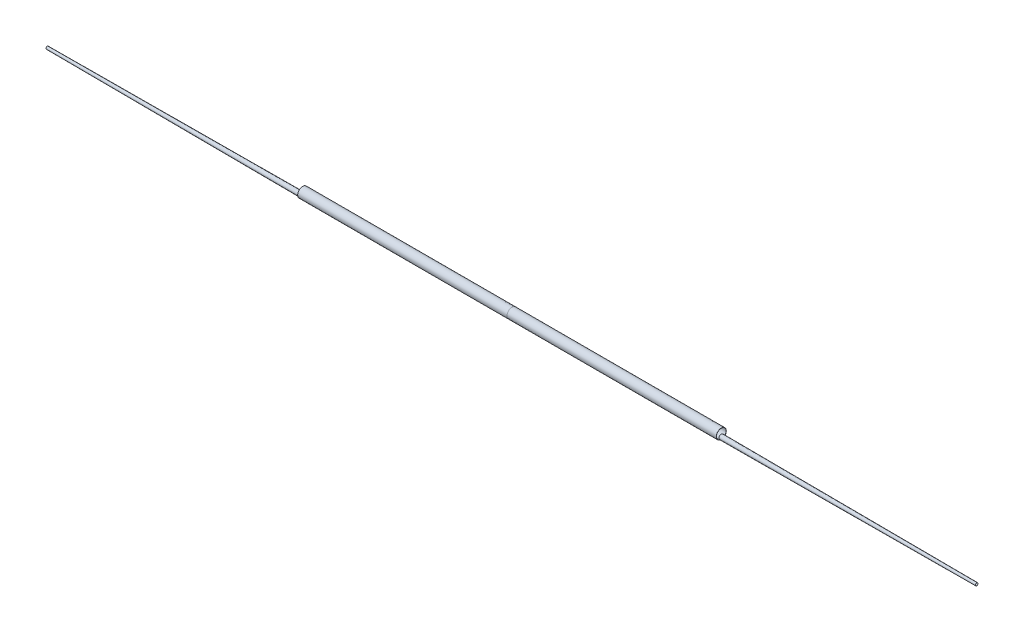
ISO-10303-21;
HEADER;
FILE_DESCRIPTION(('STEP AP214'),'2;1');
FILE_NAME('part.step','',(''),(''),'','','');
FILE_SCHEMA(('AUTOMOTIVE_DESIGN { 1 0 10303 214 1 1 1 1 }'));
ENDSEC;
DATA;
#1=APPLICATION_CONTEXT('core data for automotive mechanical design processes');
#2=APPLICATION_PROTOCOL_DEFINITION('international standard','automotive_design',2000,#1);
#3=PRODUCT_CONTEXT('',#1,'mechanical');
#4=PRODUCT('Part','Part','',(#3));
#5=PRODUCT_RELATED_PRODUCT_CATEGORY('part','',(#4));
#6=PRODUCT_DEFINITION_FORMATION('','',#4);
#7=PRODUCT_DEFINITION_CONTEXT('part definition',#1,'design');
#8=PRODUCT_DEFINITION('design','',#6,#7);
#9=PRODUCT_DEFINITION_SHAPE('','',#8);
#10=(LENGTH_UNIT() NAMED_UNIT(*) SI_UNIT(.MILLI.,.METRE.));
#11=(NAMED_UNIT(*) PLANE_ANGLE_UNIT() SI_UNIT($,.RADIAN.));
#12=(NAMED_UNIT(*) SI_UNIT($,.STERADIAN.) SOLID_ANGLE_UNIT());
#13=UNCERTAINTY_MEASURE_WITH_UNIT(LENGTH_MEASURE(1.E-05),#10,'distance_accuracy_value','');
#14=(GEOMETRIC_REPRESENTATION_CONTEXT(3) GLOBAL_UNCERTAINTY_ASSIGNED_CONTEXT((#13)) GLOBAL_UNIT_ASSIGNED_CONTEXT((#10,
#11,#12)) REPRESENTATION_CONTEXT('',''));
#15=CARTESIAN_POINT('',(0.,0.,0.));
#16=DIRECTION('',(0.,0.,1.));
#17=DIRECTION('',(1.,0.,0.));
#18=AXIS2_PLACEMENT_3D('',#15,#16,#17);
#19=CARTESIAN_POINT('',(-749.3,24.54402,-363.728));
#20=DIRECTION('',(1.,0.,0.));
#21=DIRECTION('',(0.,0.,1.));
#22=AXIS2_PLACEMENT_3D('',#19,#20,#21);
#23=CYLINDRICAL_SURFACE('',#22,17.907);
#24=CARTESIAN_POINT('',(-749.3,24.54402,-363.728));
#25=DIRECTION('',(1.,0.,0.));
#26=DIRECTION('',(0.,0.,-1.));
#27=AXIS2_PLACEMENT_3D('',#24,#25,#26);
#28=CIRCLE('',#27,17.907);
#29=CARTESIAN_POINT('',(-749.3,24.54402,-345.821));
#30=VERTEX_POINT('',#29);
#31=EDGE_CURVE('E12',#30,#30,#28,.T.);
#32=CARTESIAN_POINT('',(0.,24.54402,-363.728));
#33=DIRECTION('',(1.,0.,0.));
#34=DIRECTION('',(0.,0.,-1.));
#35=AXIS2_PLACEMENT_3D('',#32,#33,#34);
#36=CIRCLE('',#35,17.907);
#37=CARTESIAN_POINT('',(0.,24.54402,-345.821));
#38=VERTEX_POINT('',#37);
#39=EDGE_CURVE('E50',#38,#38,#36,.T.);
#40=CARTESIAN_POINT('',(-749.3,24.54402,-345.821));
#41=CARTESIAN_POINT('',(-741.494791666667,24.54402,-345.821));
#42=CARTESIAN_POINT('',(-733.689583333333,24.54402,-345.821));
#43=CARTESIAN_POINT('',(-718.079166666667,24.54402,-345.821));
#44=CARTESIAN_POINT('',(-710.273958333333,24.54402,-345.821));
#45=CARTESIAN_POINT('',(-694.663541666667,24.54402,-345.821));
#46=CARTESIAN_POINT('',(-686.858333333333,24.54402,-345.821));
#47=CARTESIAN_POINT('',(-671.247916666667,24.54402,-345.821));
#48=CARTESIAN_POINT('',(-663.442708333333,24.54402,-345.821));
#49=CARTESIAN_POINT('',(-647.832291666667,24.54402,-345.821));
#50=CARTESIAN_POINT('',(-640.027083333333,24.54402,-345.821));
#51=CARTESIAN_POINT('',(-624.416666666667,24.54402,-345.821));
#52=CARTESIAN_POINT('',(-616.611458333333,24.54402,-345.821));
#53=CARTESIAN_POINT('',(-601.001041666667,24.54402,-345.821));
#54=CARTESIAN_POINT('',(-593.195833333333,24.54402,-345.821));
#55=CARTESIAN_POINT('',(-577.585416666667,24.54402,-345.821));
#56=CARTESIAN_POINT('',(-569.780208333333,24.54402,-345.821));
#57=CARTESIAN_POINT('',(-554.169791666667,24.54402,-345.821));
#58=CARTESIAN_POINT('',(-546.364583333333,24.54402,-345.821));
#59=CARTESIAN_POINT('',(-530.754166666667,24.54402,-345.821));
#60=CARTESIAN_POINT('',(-522.948958333333,24.54402,-345.821));
#61=CARTESIAN_POINT('',(-507.338541666667,24.54402,-345.821));
#62=CARTESIAN_POINT('',(-499.533333333333,24.54402,-345.821));
#63=CARTESIAN_POINT('',(-483.922916666667,24.54402,-345.821));
#64=CARTESIAN_POINT('',(-476.117708333333,24.54402,-345.821));
#65=CARTESIAN_POINT('',(-460.507291666667,24.54402,-345.821));
#66=CARTESIAN_POINT('',(-452.702083333333,24.54402,-345.821));
#67=CARTESIAN_POINT('',(-437.091666666667,24.54402,-345.821));
#68=CARTESIAN_POINT('',(-429.286458333333,24.54402,-345.821));
#69=CARTESIAN_POINT('',(-413.676041666667,24.54402,-345.821));
#70=CARTESIAN_POINT('',(-405.870833333333,24.54402,-345.821));
#71=CARTESIAN_POINT('',(-390.260416666667,24.54402,-345.821));
#72=CARTESIAN_POINT('',(-382.455208333333,24.54402,-345.821));
#73=CARTESIAN_POINT('',(-366.844791666667,24.54402,-345.821));
#74=CARTESIAN_POINT('',(-359.039583333333,24.54402,-345.821));
#75=CARTESIAN_POINT('',(-343.429166666667,24.54402,-345.821));
#76=CARTESIAN_POINT('',(-335.623958333333,24.54402,-345.821));
#77=CARTESIAN_POINT('',(-320.013541666667,24.54402,-345.821));
#78=CARTESIAN_POINT('',(-312.208333333333,24.54402,-345.821));
#79=CARTESIAN_POINT('',(-296.597916666667,24.54402,-345.821));
#80=CARTESIAN_POINT('',(-288.792708333333,24.54402,-345.821));
#81=CARTESIAN_POINT('',(-273.182291666667,24.54402,-345.821));
#82=CARTESIAN_POINT('',(-265.377083333333,24.54402,-345.821));
#83=CARTESIAN_POINT('',(-249.766666666667,24.54402,-345.821));
#84=CARTESIAN_POINT('',(-241.961458333333,24.54402,-345.821));
#85=CARTESIAN_POINT('',(-226.351041666667,24.54402,-345.821));
#86=CARTESIAN_POINT('',(-218.545833333333,24.54402,-345.821));
#87=CARTESIAN_POINT('',(-202.935416666667,24.54402,-345.821));
#88=CARTESIAN_POINT('',(-195.130208333333,24.54402,-345.821));
#89=CARTESIAN_POINT('',(-179.519791666667,24.54402,-345.821));
#90=CARTESIAN_POINT('',(-171.714583333333,24.54402,-345.821));
#91=CARTESIAN_POINT('',(-156.104166666667,24.54402,-345.821));
#92=CARTESIAN_POINT('',(-148.298958333333,24.54402,-345.821));
#93=CARTESIAN_POINT('',(-132.688541666667,24.54402,-345.821));
#94=CARTESIAN_POINT('',(-124.883333333333,24.54402,-345.821));
#95=CARTESIAN_POINT('',(-109.272916666667,24.54402,-345.821));
#96=CARTESIAN_POINT('',(-101.467708333333,24.54402,-345.821));
#97=CARTESIAN_POINT('',(-85.8572916666667,24.54402,-345.821));
#98=CARTESIAN_POINT('',(-78.0520833333334,24.54402,-345.821));
#99=CARTESIAN_POINT('',(-62.4416666666667,24.54402,-345.821));
#100=CARTESIAN_POINT('',(-54.6364583333333,24.54402,-345.821));
#101=CARTESIAN_POINT('',(-39.0260416666667,24.54402,-345.821));
#102=CARTESIAN_POINT('',(-31.2208333333334,24.54402,-345.821));
#103=CARTESIAN_POINT('',(-15.6104166666667,24.54402,-345.821));
#104=CARTESIAN_POINT('',(-7.80520833333335,24.54402,-345.821));
#105=CARTESIAN_POINT('',(0.,24.54402,-345.821));
#106=B_SPLINE_CURVE_WITH_KNOTS('',3,(#40,#41,#42,#43,#44,#45,#46,#47,#48,#49,#50,#51,#52,#53,
#54,#55,#56,#57,#58,#59,#60,#61,#62,#63,#64,#65,#66,#67,#68,#69,#70,#71,#72,#73,#74,#75,#76,#77,
#78,#79,#80,#81,#82,#83,#84,#85,#86,#87,#88,#89,#90,#91,#92,#93,#94,#95,#96,#97,#98,#99,#100,
#101,#102,#103,#104,#105),.UNSPECIFIED.,.F.,.F.,(4,2,2,2,2,2,2,2,2,2,2,2,2,2,2,2,2,2,2,2,2,2,2,
2,2,2,2,2,2,2,2,2,4),(0.,23.4156250000001,46.8312500000001,70.246875,93.6625000000001,
117.078125,140.49375,163.909375,187.325,210.740625,234.15625,257.571875,280.9875,304.403125,
327.81875,351.234375,374.65,398.065625,421.48125,444.896875,468.3125,491.728125,515.14375,
538.559375,561.975,585.390625,608.80625,632.221875,655.6375,679.053125,702.46875,725.884375,
749.3),.UNSPECIFIED.);
#107=EDGE_CURVE('BSEAM47',#30,#38,#106,.T.);
#108=ORIENTED_EDGE('',*,*,#31,.T.);
#109=ORIENTED_EDGE('',*,*,#39,.F.);
#110=ORIENTED_EDGE('',*,*,#107,.T.);
#111=ORIENTED_EDGE('',*,*,#107,.F.);
#112=EDGE_LOOP('',(#108,#110,#109,#111));
#113=FACE_BOUND('',#112,.T.);
#114=ADVANCED_FACE('F47',(#113),#23,.T.);
#115=CARTESIAN_POINT('',(-749.3,24.54402,-363.728));
#116=DIRECTION('',(-1.,0.,0.));
#117=DIRECTION('',(0.,0.,-1.));
#118=AXIS2_PLACEMENT_3D('',#115,#116,#117);
#119=PLANE('',#118);
#120=CARTESIAN_POINT('',(-749.3,24.54402,-363.728));
#121=DIRECTION('',(1.,0.,0.));
#122=DIRECTION('',(0.,0.,-1.));
#123=AXIS2_PLACEMENT_3D('',#120,#121,#122);
#124=CIRCLE('',#123,17.145);
#125=CARTESIAN_POINT('',(-749.3,24.54402,-346.583));
#126=VERTEX_POINT('',#125);
#127=EDGE_CURVE('E57',#126,#126,#124,.T.);
#128=ORIENTED_EDGE('',*,*,#127,.T.);
#129=EDGE_LOOP('',(#128));
#130=FACE_BOUND('',#129,.T.);
#131=ORIENTED_EDGE('',*,*,#31,.F.);
#132=EDGE_LOOP('',(#131));
#133=FACE_BOUND('',#132,.T.);
#134=ADVANCED_FACE('F65',(#130,#133),#119,.T.);
#135=CARTESIAN_POINT('',(0.,24.54402,-363.728));
#136=DIRECTION('',(-1.,0.,0.));
#137=DIRECTION('',(0.,0.,-1.));
#138=AXIS2_PLACEMENT_3D('',#135,#136,#137);
#139=PLANE('',#138);
#140=CARTESIAN_POINT('',(0.,24.54402,-363.728));
#141=DIRECTION('',(1.,0.,0.));
#142=DIRECTION('',(0.,0.,-1.));
#143=AXIS2_PLACEMENT_3D('',#140,#141,#142);
#144=CIRCLE('',#143,17.145);
#145=CARTESIAN_POINT('',(0.,24.54402,-346.583));
#146=VERTEX_POINT('',#145);
#147=EDGE_CURVE('E59',#146,#146,#144,.T.);
#148=ORIENTED_EDGE('',*,*,#147,.F.);
#149=EDGE_LOOP('',(#148));
#150=FACE_BOUND('',#149,.T.);
#151=ORIENTED_EDGE('',*,*,#39,.T.);
#152=EDGE_LOOP('',(#151));
#153=FACE_BOUND('',#152,.T.);
#154=ADVANCED_FACE('F71',(#150,#153),#139,.F.);
#155=CARTESIAN_POINT('',(-749.3,24.54402,-363.728));
#156=DIRECTION('',(1.,0.,0.));
#157=DIRECTION('',(0.,0.,1.));
#158=AXIS2_PLACEMENT_3D('',#155,#156,#157);
#159=CYLINDRICAL_SURFACE('',#158,17.145);
#160=CARTESIAN_POINT('',(-749.3,24.54402,-346.583));
#161=CARTESIAN_POINT('',(-741.494791666667,24.54402,-346.583));
#162=CARTESIAN_POINT('',(-733.689583333333,24.54402,-346.583));
#163=CARTESIAN_POINT('',(-718.079166666667,24.54402,-346.583));
#164=CARTESIAN_POINT('',(-710.273958333333,24.54402,-346.583));
#165=CARTESIAN_POINT('',(-694.663541666667,24.54402,-346.583));
#166=CARTESIAN_POINT('',(-686.858333333333,24.54402,-346.583));
#167=CARTESIAN_POINT('',(-671.247916666667,24.54402,-346.583));
#168=CARTESIAN_POINT('',(-663.442708333333,24.54402,-346.583));
#169=CARTESIAN_POINT('',(-647.832291666667,24.54402,-346.583));
#170=CARTESIAN_POINT('',(-640.027083333333,24.54402,-346.583));
#171=CARTESIAN_POINT('',(-624.416666666667,24.54402,-346.583));
#172=CARTESIAN_POINT('',(-616.611458333333,24.54402,-346.583));
#173=CARTESIAN_POINT('',(-601.001041666667,24.54402,-346.583));
#174=CARTESIAN_POINT('',(-593.195833333333,24.54402,-346.583));
#175=CARTESIAN_POINT('',(-577.585416666667,24.54402,-346.583));
#176=CARTESIAN_POINT('',(-569.780208333333,24.54402,-346.583));
#177=CARTESIAN_POINT('',(-554.169791666667,24.54402,-346.583));
#178=CARTESIAN_POINT('',(-546.364583333333,24.54402,-346.583));
#179=CARTESIAN_POINT('',(-530.754166666667,24.54402,-346.583));
#180=CARTESIAN_POINT('',(-522.948958333333,24.54402,-346.583));
#181=CARTESIAN_POINT('',(-507.338541666667,24.54402,-346.583));
#182=CARTESIAN_POINT('',(-499.533333333333,24.54402,-346.583));
#183=CARTESIAN_POINT('',(-483.922916666667,24.54402,-346.583));
#184=CARTESIAN_POINT('',(-476.117708333333,24.54402,-346.583));
#185=CARTESIAN_POINT('',(-460.507291666667,24.54402,-346.583));
#186=CARTESIAN_POINT('',(-452.702083333333,24.54402,-346.583));
#187=CARTESIAN_POINT('',(-437.091666666667,24.54402,-346.583));
#188=CARTESIAN_POINT('',(-429.286458333333,24.54402,-346.583));
#189=CARTESIAN_POINT('',(-413.676041666667,24.54402,-346.583));
#190=CARTESIAN_POINT('',(-405.870833333333,24.54402,-346.583));
#191=CARTESIAN_POINT('',(-390.260416666667,24.54402,-346.583));
#192=CARTESIAN_POINT('',(-382.455208333333,24.54402,-346.583));
#193=CARTESIAN_POINT('',(-366.844791666667,24.54402,-346.583));
#194=CARTESIAN_POINT('',(-359.039583333333,24.54402,-346.583));
#195=CARTESIAN_POINT('',(-343.429166666667,24.54402,-346.583));
#196=CARTESIAN_POINT('',(-335.623958333333,24.54402,-346.583));
#197=CARTESIAN_POINT('',(-320.013541666667,24.54402,-346.583));
#198=CARTESIAN_POINT('',(-312.208333333333,24.54402,-346.583));
#199=CARTESIAN_POINT('',(-296.597916666667,24.54402,-346.583));
#200=CARTESIAN_POINT('',(-288.792708333333,24.54402,-346.583));
#201=CARTESIAN_POINT('',(-273.182291666667,24.54402,-346.583));
#202=CARTESIAN_POINT('',(-265.377083333333,24.54402,-346.583));
#203=CARTESIAN_POINT('',(-249.766666666667,24.54402,-346.583));
#204=CARTESIAN_POINT('',(-241.961458333333,24.54402,-346.583));
#205=CARTESIAN_POINT('',(-226.351041666667,24.54402,-346.583));
#206=CARTESIAN_POINT('',(-218.545833333333,24.54402,-346.583));
#207=CARTESIAN_POINT('',(-202.935416666667,24.54402,-346.583));
#208=CARTESIAN_POINT('',(-195.130208333333,24.54402,-346.583));
#209=CARTESIAN_POINT('',(-179.519791666667,24.54402,-346.583));
#210=CARTESIAN_POINT('',(-171.714583333333,24.54402,-346.583));
#211=CARTESIAN_POINT('',(-156.104166666667,24.54402,-346.583));
#212=CARTESIAN_POINT('',(-148.298958333333,24.54402,-346.583));
#213=CARTESIAN_POINT('',(-132.688541666667,24.54402,-346.583));
#214=CARTESIAN_POINT('',(-124.883333333333,24.54402,-346.583));
#215=CARTESIAN_POINT('',(-109.272916666667,24.54402,-346.583));
#216=CARTESIAN_POINT('',(-101.467708333333,24.54402,-346.583));
#217=CARTESIAN_POINT('',(-85.8572916666667,24.54402,-346.583));
#218=CARTESIAN_POINT('',(-78.0520833333334,24.54402,-346.583));
#219=CARTESIAN_POINT('',(-62.4416666666667,24.54402,-346.583));
#220=CARTESIAN_POINT('',(-54.6364583333333,24.54402,-346.583));
#221=CARTESIAN_POINT('',(-39.0260416666667,24.54402,-346.583));
#222=CARTESIAN_POINT('',(-31.2208333333334,24.54402,-346.583));
#223=CARTESIAN_POINT('',(-15.6104166666667,24.54402,-346.583));
#224=CARTESIAN_POINT('',(-7.80520833333335,24.54402,-346.583));
#225=CARTESIAN_POINT('',(0.,24.54402,-346.583));
#226=B_SPLINE_CURVE_WITH_KNOTS('',3,(#160,#161,#162,#163,#164,#165,#166,#167,#168,#169,#170,
#171,#172,#173,#174,#175,#176,#177,#178,#179,#180,#181,#182,#183,#184,#185,#186,#187,#188,#189,
#190,#191,#192,#193,#194,#195,#196,#197,#198,#199,#200,#201,#202,#203,#204,#205,#206,#207,#208,
#209,#210,#211,#212,#213,#214,#215,#216,#217,#218,#219,#220,#221,#222,#223,#224,#225),
.UNSPECIFIED.,.F.,.F.,(4,2,2,2,2,2,2,2,2,2,2,2,2,2,2,2,2,2,2,2,2,2,2,2,2,2,2,2,2,2,2,2,4),(0.,
23.4156250000001,46.8312500000001,70.246875,93.6625000000001,117.078125,140.49375,163.909375,
187.325,210.740625,234.15625,257.571875,280.9875,304.403125,327.81875,351.234375,374.65,
398.065625,421.48125,444.896875,468.3125,491.728125,515.14375,538.559375,561.975,585.390625,
608.80625,632.221875,655.6375,679.053125,702.46875,725.884375,749.3),.UNSPECIFIED.);
#227=EDGE_CURVE('BSEAM68',#126,#146,#226,.T.);
#228=ORIENTED_EDGE('',*,*,#127,.F.);
#229=ORIENTED_EDGE('',*,*,#147,.T.);
#230=ORIENTED_EDGE('',*,*,#227,.T.);
#231=ORIENTED_EDGE('',*,*,#227,.F.);
#232=EDGE_LOOP('',(#228,#230,#229,#231));
#233=FACE_BOUND('',#232,.T.);
#234=ADVANCED_FACE('F68',(#233),#159,.F.);
#235=CLOSED_SHELL('',(#114,#134,#154,#234));
#236=MANIFOLD_SOLID_BREP('B2',#235);
#237=CARTESIAN_POINT('',(-749.3,15.08252,-363.728));
#238=DIRECTION('',(-1.,0.,0.));
#239=DIRECTION('',(0.,0.,-1.));
#240=AXIS2_PLACEMENT_3D('',#237,#238,#239);
#241=PLANE('',#240);
#242=CARTESIAN_POINT('',(-749.3,15.08252,-363.728));
#243=DIRECTION('',(1.,0.,0.));
#244=DIRECTION('',(0.,0.,-1.));
#245=AXIS2_PLACEMENT_3D('',#242,#243,#244);
#246=CIRCLE('',#245,8.19149782444834);
#247=CARTESIAN_POINT('',(-749.3,15.08252,-371.919497824448));
#248=VERTEX_POINT('',#247);
#249=EDGE_CURVE('E129',#248,#248,#246,.T.);
#250=ORIENTED_EDGE('',*,*,#249,.F.);
#251=EDGE_LOOP('',(#250));
#252=FACE_BOUND('',#251,.T.);
#253=CARTESIAN_POINT('',(-749.3,15.08252,-363.728));
#254=DIRECTION('',(1.,0.,0.));
#255=DIRECTION('',(0.,0.,-1.));
#256=AXIS2_PLACEMENT_3D('',#253,#254,#255);
#257=CIRCLE('',#256,8.44549999999998);
#258=CARTESIAN_POINT('',(-749.3,15.08252,-372.1735));
#259=VERTEX_POINT('',#258);
#260=EDGE_CURVE('E46',#259,#259,#257,.T.);
#261=ORIENTED_EDGE('',*,*,#260,.T.);
#262=EDGE_LOOP('',(#261));
#263=FACE_BOUND('',#262,.T.);
#264=ADVANCED_FACE('F116',(#252,#263),#241,.F.);
#265=CARTESIAN_POINT('',(-1663.7,15.08252,-363.728));
#266=DIRECTION('',(-1.,0.,0.));
#267=DIRECTION('',(0.,0.,-1.));
#268=AXIS2_PLACEMENT_3D('',#265,#266,#267);
#269=PLANE('',#268);
#270=CARTESIAN_POINT('',(-1663.7,15.08252,-363.728));
#271=DIRECTION('',(1.,0.,0.));
#272=DIRECTION('',(0.,0.,-1.));
#273=AXIS2_PLACEMENT_3D('',#270,#271,#272);
#274=CIRCLE('',#273,4.40689782444836);
#275=CARTESIAN_POINT('',(-1663.7,15.08252,-368.134897824448));
#276=VERTEX_POINT('',#275);
#277=EDGE_CURVE('E185',#276,#276,#274,.T.);
#278=ORIENTED_EDGE('',*,*,#277,.T.);
#279=EDGE_LOOP('',(#278));
#280=FACE_BOUND('',#279,.T.);
#281=CARTESIAN_POINT('',(-1663.7,15.08252,-363.728));
#282=DIRECTION('',(1.,0.,0.));
#283=DIRECTION('',(0.,0.,-1.));
#284=AXIS2_PLACEMENT_3D('',#281,#282,#283);
#285=CIRCLE('',#284,4.6609);
#286=CARTESIAN_POINT('',(-1663.7,15.08252,-368.3889));
#287=VERTEX_POINT('',#286);
#288=EDGE_CURVE('E124',#287,#287,#285,.T.);
#289=ORIENTED_EDGE('',*,*,#288,.F.);
#290=EDGE_LOOP('',(#289));
#291=FACE_BOUND('',#290,.T.);
#292=ADVANCED_FACE('F148',(#280,#291),#269,.T.);
#293=CARTESIAN_POINT('',(-1663.7,15.08252,-363.728));
#294=DIRECTION('',(1.,0.,0.));
#295=DIRECTION('',(0.,0.,1.));
#296=AXIS2_PLACEMENT_3D('',#293,#294,#295);
#297=CONICAL_SURFACE('',#296,4.6609,0.00413886525552267);
#298=ORIENTED_EDGE('',*,*,#288,.T.);
#299=EDGE_LOOP('',(#298));
#300=FACE_BOUND('',#299,.T.);
#301=ORIENTED_EDGE('',*,*,#260,.F.);
#302=EDGE_LOOP('',(#301));
#303=FACE_BOUND('',#302,.T.);
#304=ADVANCED_FACE('F157',(#300,#303),#297,.T.);
#305=CARTESIAN_POINT('',(-1663.69894873123,15.08252,-363.728));
#306=DIRECTION('',(1.,0.,0.));
#307=DIRECTION('',(0.,0.,1.));
#308=AXIS2_PLACEMENT_3D('',#305,#306,#307);
#309=CONICAL_SURFACE('',#308,4.40690217553301,0.00413886525552267);
#310=ORIENTED_EDGE('',*,*,#277,.F.);
#311=EDGE_LOOP('',(#310));
#312=FACE_BOUND('',#311,.T.);
#313=ORIENTED_EDGE('',*,*,#249,.T.);
#314=EDGE_LOOP('',(#313));
#315=FACE_BOUND('',#314,.T.);
#316=ADVANCED_FACE('F159',(#312,#315),#309,.F.);
#317=CLOSED_SHELL('',(#264,#292,#304,#316));
#318=MANIFOLD_SOLID_BREP('B7',#317);
#319=CARTESIAN_POINT('',(749.3,15.08252,-363.728));
#320=DIRECTION('',(1.,0.,0.));
#321=DIRECTION('',(0.,0.,-1.));
#322=AXIS2_PLACEMENT_3D('',#319,#320,#321);
#323=PLANE('',#322);
#324=CARTESIAN_POINT('',(749.3,15.08252,-363.728));
#325=DIRECTION('',(1.,0.,0.));
#326=DIRECTION('',(0.,0.,-1.));
#327=AXIS2_PLACEMENT_3D('',#324,#325,#326);
#328=CIRCLE('',#327,8.19149782444834);
#329=CARTESIAN_POINT('',(749.3,15.08252,-371.919497824448));
#330=VERTEX_POINT('',#329);
#331=EDGE_CURVE('E241',#330,#330,#328,.T.);
#332=ORIENTED_EDGE('',*,*,#331,.T.);
#333=EDGE_LOOP('',(#332));
#334=FACE_BOUND('',#333,.T.);
#335=CARTESIAN_POINT('',(749.3,15.08252,-363.728));
#336=DIRECTION('',(1.,0.,0.));
#337=DIRECTION('',(0.,0.,-1.));
#338=AXIS2_PLACEMENT_3D('',#335,#336,#337);
#339=CIRCLE('',#338,8.44549999999998);
#340=CARTESIAN_POINT('',(749.3,15.08252,-372.1735));
#341=VERTEX_POINT('',#340);
#342=EDGE_CURVE('E115',#341,#341,#339,.T.);
#343=ORIENTED_EDGE('',*,*,#342,.F.);
#344=EDGE_LOOP('',(#343));
#345=FACE_BOUND('',#344,.T.);
#346=ADVANCED_FACE('F228',(#334,#345),#323,.F.);
#347=CARTESIAN_POINT('',(1663.7,15.08252,-363.728));
#348=DIRECTION('',(1.,0.,0.));
#349=DIRECTION('',(0.,0.,-1.));
#350=AXIS2_PLACEMENT_3D('',#347,#348,#349);
#351=PLANE('',#350);
#352=CARTESIAN_POINT('',(1663.7,15.08252,-363.728));
#353=DIRECTION('',(1.,0.,0.));
#354=DIRECTION('',(0.,0.,-1.));
#355=AXIS2_PLACEMENT_3D('',#352,#353,#354);
#356=CIRCLE('',#355,4.40689782444836);
#357=CARTESIAN_POINT('',(1663.7,15.08252,-368.134897824448));
#358=VERTEX_POINT('',#357);
#359=EDGE_CURVE('E297',#358,#358,#356,.T.);
#360=ORIENTED_EDGE('',*,*,#359,.F.);
#361=EDGE_LOOP('',(#360));
#362=FACE_BOUND('',#361,.T.);
#363=CARTESIAN_POINT('',(1663.7,15.08252,-363.728));
#364=DIRECTION('',(1.,0.,0.));
#365=DIRECTION('',(0.,0.,-1.));
#366=AXIS2_PLACEMENT_3D('',#363,#364,#365);
#367=CIRCLE('',#366,4.6609);
#368=CARTESIAN_POINT('',(1663.7,15.08252,-368.3889));
#369=VERTEX_POINT('',#368);
#370=EDGE_CURVE('E236',#369,#369,#367,.T.);
#371=ORIENTED_EDGE('',*,*,#370,.T.);
#372=EDGE_LOOP('',(#371));
#373=FACE_BOUND('',#372,.T.);
#374=ADVANCED_FACE('F261',(#362,#373),#351,.T.);
#375=CARTESIAN_POINT('',(1663.7,15.08252,-363.728));
#376=DIRECTION('',(-1.,0.,0.));
#377=DIRECTION('',(0.,0.,1.));
#378=AXIS2_PLACEMENT_3D('',#375,#376,#377);
#379=CONICAL_SURFACE('',#378,4.6609,0.00413886525552267);
#380=ORIENTED_EDGE('',*,*,#370,.F.);
#381=EDGE_LOOP('',(#380));
#382=FACE_BOUND('',#381,.T.);
#383=ORIENTED_EDGE('',*,*,#342,.T.);
#384=EDGE_LOOP('',(#383));
#385=FACE_BOUND('',#384,.T.);
#386=ADVANCED_FACE('F270',(#382,#385),#379,.T.);
#387=CARTESIAN_POINT('',(1663.69894873123,15.08252,-363.728));
#388=DIRECTION('',(-1.,0.,0.));
#389=DIRECTION('',(0.,0.,1.));
#390=AXIS2_PLACEMENT_3D('',#387,#388,#389);
#391=CONICAL_SURFACE('',#390,4.40690217553301,0.00413886525552267);
#392=ORIENTED_EDGE('',*,*,#359,.T.);
#393=EDGE_LOOP('',(#392));
#394=FACE_BOUND('',#393,.T.);
#395=ORIENTED_EDGE('',*,*,#331,.F.);
#396=EDGE_LOOP('',(#395));
#397=FACE_BOUND('',#396,.T.);
#398=ADVANCED_FACE('F272',(#394,#397),#391,.F.);
#399=CLOSED_SHELL('',(#346,#374,#386,#398));
#400=MANIFOLD_SOLID_BREP('B41',#399);
#401=CARTESIAN_POINT('',(749.3,24.54402,-363.728));
#402=DIRECTION('',(-1.,0.,0.));
#403=DIRECTION('',(0.,0.,1.));
#404=AXIS2_PLACEMENT_3D('',#401,#402,#403);
#405=CYLINDRICAL_SURFACE('',#404,17.907);
#406=CARTESIAN_POINT('',(749.3,24.54402,-363.728));
#407=DIRECTION('',(1.,0.,0.));
#408=DIRECTION('',(0.,0.,-1.));
#409=AXIS2_PLACEMENT_3D('',#406,#407,#408);
#410=CIRCLE('',#409,17.907);
#411=CARTESIAN_POINT('',(749.3,24.54402,-345.821));
#412=VERTEX_POINT('',#411);
#413=EDGE_CURVE('E227',#412,#412,#410,.T.);
#414=CARTESIAN_POINT('',(0.,24.54402,-363.728));
#415=DIRECTION('',(1.,0.,0.));
#416=DIRECTION('',(0.,0.,-1.));
#417=AXIS2_PLACEMENT_3D('',#414,#415,#416);
#418=CIRCLE('',#417,17.907);
#419=CARTESIAN_POINT('',(0.,24.54402,-345.821));
#420=VERTEX_POINT('',#419);
#421=EDGE_CURVE('E336',#420,#420,#418,.T.);
#422=CARTESIAN_POINT('',(749.3,24.54402,-345.821));
#423=CARTESIAN_POINT('',(741.494791666667,24.54402,-345.821));
#424=CARTESIAN_POINT('',(733.689583333333,24.54402,-345.821));
#425=CARTESIAN_POINT('',(718.079166666667,24.54402,-345.821));
#426=CARTESIAN_POINT('',(710.273958333333,24.54402,-345.821));
#427=CARTESIAN_POINT('',(694.663541666667,24.54402,-345.821));
#428=CARTESIAN_POINT('',(686.858333333333,24.54402,-345.821));
#429=CARTESIAN_POINT('',(671.247916666667,24.54402,-345.821));
#430=CARTESIAN_POINT('',(663.442708333333,24.54402,-345.821));
#431=CARTESIAN_POINT('',(647.832291666667,24.54402,-345.821));
#432=CARTESIAN_POINT('',(640.027083333333,24.54402,-345.821));
#433=CARTESIAN_POINT('',(624.416666666667,24.54402,-345.821));
#434=CARTESIAN_POINT('',(616.611458333333,24.54402,-345.821));
#435=CARTESIAN_POINT('',(601.001041666667,24.54402,-345.821));
#436=CARTESIAN_POINT('',(593.195833333333,24.54402,-345.821));
#437=CARTESIAN_POINT('',(577.585416666667,24.54402,-345.821));
#438=CARTESIAN_POINT('',(569.780208333333,24.54402,-345.821));
#439=CARTESIAN_POINT('',(554.169791666667,24.54402,-345.821));
#440=CARTESIAN_POINT('',(546.364583333333,24.54402,-345.821));
#441=CARTESIAN_POINT('',(530.754166666667,24.54402,-345.821));
#442=CARTESIAN_POINT('',(522.948958333333,24.54402,-345.821));
#443=CARTESIAN_POINT('',(507.338541666667,24.54402,-345.821));
#444=CARTESIAN_POINT('',(499.533333333333,24.54402,-345.821));
#445=CARTESIAN_POINT('',(483.922916666667,24.54402,-345.821));
#446=CARTESIAN_POINT('',(476.117708333333,24.54402,-345.821));
#447=CARTESIAN_POINT('',(460.507291666667,24.54402,-345.821));
#448=CARTESIAN_POINT('',(452.702083333333,24.54402,-345.821));
#449=CARTESIAN_POINT('',(437.091666666667,24.54402,-345.821));
#450=CARTESIAN_POINT('',(429.286458333333,24.54402,-345.821));
#451=CARTESIAN_POINT('',(413.676041666667,24.54402,-345.821));
#452=CARTESIAN_POINT('',(405.870833333333,24.54402,-345.821));
#453=CARTESIAN_POINT('',(390.260416666667,24.54402,-345.821));
#454=CARTESIAN_POINT('',(382.455208333333,24.54402,-345.821));
#455=CARTESIAN_POINT('',(366.844791666667,24.54402,-345.821));
#456=CARTESIAN_POINT('',(359.039583333333,24.54402,-345.821));
#457=CARTESIAN_POINT('',(343.429166666667,24.54402,-345.821));
#458=CARTESIAN_POINT('',(335.623958333333,24.54402,-345.821));
#459=CARTESIAN_POINT('',(320.013541666667,24.54402,-345.821));
#460=CARTESIAN_POINT('',(312.208333333333,24.54402,-345.821));
#461=CARTESIAN_POINT('',(296.597916666667,24.54402,-345.821));
#462=CARTESIAN_POINT('',(288.792708333333,24.54402,-345.821));
#463=CARTESIAN_POINT('',(273.182291666667,24.54402,-345.821));
#464=CARTESIAN_POINT('',(265.377083333333,24.54402,-345.821));
#465=CARTESIAN_POINT('',(249.766666666667,24.54402,-345.821));
#466=CARTESIAN_POINT('',(241.961458333333,24.54402,-345.821));
#467=CARTESIAN_POINT('',(226.351041666667,24.54402,-345.821));
#468=CARTESIAN_POINT('',(218.545833333333,24.54402,-345.821));
#469=CARTESIAN_POINT('',(202.935416666667,24.54402,-345.821));
#470=CARTESIAN_POINT('',(195.130208333333,24.54402,-345.821));
#471=CARTESIAN_POINT('',(179.519791666667,24.54402,-345.821));
#472=CARTESIAN_POINT('',(171.714583333333,24.54402,-345.821));
#473=CARTESIAN_POINT('',(156.104166666667,24.54402,-345.821));
#474=CARTESIAN_POINT('',(148.298958333333,24.54402,-345.821));
#475=CARTESIAN_POINT('',(132.688541666667,24.54402,-345.821));
#476=CARTESIAN_POINT('',(124.883333333333,24.54402,-345.821));
#477=CARTESIAN_POINT('',(109.272916666667,24.54402,-345.821));
#478=CARTESIAN_POINT('',(101.467708333333,24.54402,-345.821));
#479=CARTESIAN_POINT('',(85.8572916666667,24.54402,-345.821));
#480=CARTESIAN_POINT('',(78.0520833333334,24.54402,-345.821));
#481=CARTESIAN_POINT('',(62.4416666666667,24.54402,-345.821));
#482=CARTESIAN_POINT('',(54.6364583333333,24.54402,-345.821));
#483=CARTESIAN_POINT('',(39.0260416666667,24.54402,-345.821));
#484=CARTESIAN_POINT('',(31.2208333333334,24.54402,-345.821));
#485=CARTESIAN_POINT('',(15.6104166666667,24.54402,-345.821));
#486=CARTESIAN_POINT('',(7.80520833333335,24.54402,-345.821));
#487=CARTESIAN_POINT('',(0.,24.54402,-345.821));
#488=B_SPLINE_CURVE_WITH_KNOTS('',3,(#422,#423,#424,#425,#426,#427,#428,#429,#430,#431,#432,
#433,#434,#435,#436,#437,#438,#439,#440,#441,#442,#443,#444,#445,#446,#447,#448,#449,#450,#451,
#452,#453,#454,#455,#456,#457,#458,#459,#460,#461,#462,#463,#464,#465,#466,#467,#468,#469,#470,
#471,#472,#473,#474,#475,#476,#477,#478,#479,#480,#481,#482,#483,#484,#485,#486,#487),
.UNSPECIFIED.,.F.,.F.,(4,2,2,2,2,2,2,2,2,2,2,2,2,2,2,2,2,2,2,2,2,2,2,2,2,2,2,2,2,2,2,2,4),(0.,
23.4156250000001,46.8312500000001,70.246875,93.6625000000001,117.078125,140.49375,163.909375,
187.325,210.740625,234.15625,257.571875,280.9875,304.403125,327.81875,351.234375,374.65,
398.065625,421.48125,444.896875,468.3125,491.728125,515.14375,538.559375,561.975,585.390625,
608.80625,632.221875,655.6375,679.053125,702.46875,725.884375,749.3),.UNSPECIFIED.);
#489=EDGE_CURVE('BSEAM333',#412,#420,#488,.T.);
#490=ORIENTED_EDGE('',*,*,#413,.F.);
#491=ORIENTED_EDGE('',*,*,#421,.T.);
#492=ORIENTED_EDGE('',*,*,#489,.T.);
#493=ORIENTED_EDGE('',*,*,#489,.F.);
#494=EDGE_LOOP('',(#490,#492,#491,#493));
#495=FACE_BOUND('',#494,.T.);
#496=ADVANCED_FACE('F333',(#495),#405,.T.);
#497=CARTESIAN_POINT('',(749.3,24.54402,-363.728));
#498=DIRECTION('',(1.,0.,0.));
#499=DIRECTION('',(0.,0.,-1.));
#500=AXIS2_PLACEMENT_3D('',#497,#498,#499);
#501=PLANE('',#500);
#502=CARTESIAN_POINT('',(749.3,24.54402,-363.728));
#503=DIRECTION('',(1.,0.,0.));
#504=DIRECTION('',(0.,0.,-1.));
#505=AXIS2_PLACEMENT_3D('',#502,#503,#504);
#506=CIRCLE('',#505,17.145);
#507=CARTESIAN_POINT('',(749.3,24.54402,-346.583));
#508=VERTEX_POINT('',#507);
#509=EDGE_CURVE('E343',#508,#508,#506,.T.);
#510=ORIENTED_EDGE('',*,*,#509,.F.);
#511=EDGE_LOOP('',(#510));
#512=FACE_BOUND('',#511,.T.);
#513=ORIENTED_EDGE('',*,*,#413,.T.);
#514=EDGE_LOOP('',(#513));
#515=FACE_BOUND('',#514,.T.);
#516=ADVANCED_FACE('F354',(#512,#515),#501,.T.);
#517=CARTESIAN_POINT('',(0.,24.54402,-363.728));
#518=DIRECTION('',(1.,0.,0.));
#519=DIRECTION('',(0.,0.,-1.));
#520=AXIS2_PLACEMENT_3D('',#517,#518,#519);
#521=PLANE('',#520);
#522=CARTESIAN_POINT('',(0.,24.54402,-363.728));
#523=DIRECTION('',(1.,0.,0.));
#524=DIRECTION('',(0.,0.,-1.));
#525=AXIS2_PLACEMENT_3D('',#522,#523,#524);
#526=CIRCLE('',#525,17.145);
#527=CARTESIAN_POINT('',(0.,24.54402,-346.583));
#528=VERTEX_POINT('',#527);
#529=EDGE_CURVE('E345',#528,#528,#526,.T.);
#530=ORIENTED_EDGE('',*,*,#529,.T.);
#531=EDGE_LOOP('',(#530));
#532=FACE_BOUND('',#531,.T.);
#533=ORIENTED_EDGE('',*,*,#421,.F.);
#534=EDGE_LOOP('',(#533));
#535=FACE_BOUND('',#534,.T.);
#536=ADVANCED_FACE('F356',(#532,#535),#521,.F.);
#537=CARTESIAN_POINT('',(749.3,24.54402,-363.728));
#538=DIRECTION('',(-1.,0.,0.));
#539=DIRECTION('',(0.,0.,1.));
#540=AXIS2_PLACEMENT_3D('',#537,#538,#539);
#541=CYLINDRICAL_SURFACE('',#540,17.145);
#542=CARTESIAN_POINT('',(749.3,24.54402,-346.583));
#543=CARTESIAN_POINT('',(741.494791666667,24.54402,-346.583));
#544=CARTESIAN_POINT('',(733.689583333333,24.54402,-346.583));
#545=CARTESIAN_POINT('',(718.079166666667,24.54402,-346.583));
#546=CARTESIAN_POINT('',(710.273958333333,24.54402,-346.583));
#547=CARTESIAN_POINT('',(694.663541666667,24.54402,-346.583));
#548=CARTESIAN_POINT('',(686.858333333333,24.54402,-346.583));
#549=CARTESIAN_POINT('',(671.247916666667,24.54402,-346.583));
#550=CARTESIAN_POINT('',(663.442708333333,24.54402,-346.583));
#551=CARTESIAN_POINT('',(647.832291666667,24.54402,-346.583));
#552=CARTESIAN_POINT('',(640.027083333333,24.54402,-346.583));
#553=CARTESIAN_POINT('',(624.416666666667,24.54402,-346.583));
#554=CARTESIAN_POINT('',(616.611458333333,24.54402,-346.583));
#555=CARTESIAN_POINT('',(601.001041666667,24.54402,-346.583));
#556=CARTESIAN_POINT('',(593.195833333333,24.54402,-346.583));
#557=CARTESIAN_POINT('',(577.585416666667,24.54402,-346.583));
#558=CARTESIAN_POINT('',(569.780208333333,24.54402,-346.583));
#559=CARTESIAN_POINT('',(554.169791666667,24.54402,-346.583));
#560=CARTESIAN_POINT('',(546.364583333333,24.54402,-346.583));
#561=CARTESIAN_POINT('',(530.754166666667,24.54402,-346.583));
#562=CARTESIAN_POINT('',(522.948958333333,24.54402,-346.583));
#563=CARTESIAN_POINT('',(507.338541666667,24.54402,-346.583));
#564=CARTESIAN_POINT('',(499.533333333333,24.54402,-346.583));
#565=CARTESIAN_POINT('',(483.922916666667,24.54402,-346.583));
#566=CARTESIAN_POINT('',(476.117708333333,24.54402,-346.583));
#567=CARTESIAN_POINT('',(460.507291666667,24.54402,-346.583));
#568=CARTESIAN_POINT('',(452.702083333333,24.54402,-346.583));
#569=CARTESIAN_POINT('',(437.091666666667,24.54402,-346.583));
#570=CARTESIAN_POINT('',(429.286458333333,24.54402,-346.583));
#571=CARTESIAN_POINT('',(413.676041666667,24.54402,-346.583));
#572=CARTESIAN_POINT('',(405.870833333333,24.54402,-346.583));
#573=CARTESIAN_POINT('',(390.260416666667,24.54402,-346.583));
#574=CARTESIAN_POINT('',(382.455208333333,24.54402,-346.583));
#575=CARTESIAN_POINT('',(366.844791666667,24.54402,-346.583));
#576=CARTESIAN_POINT('',(359.039583333333,24.54402,-346.583));
#577=CARTESIAN_POINT('',(343.429166666667,24.54402,-346.583));
#578=CARTESIAN_POINT('',(335.623958333333,24.54402,-346.583));
#579=CARTESIAN_POINT('',(320.013541666667,24.54402,-346.583));
#580=CARTESIAN_POINT('',(312.208333333333,24.54402,-346.583));
#581=CARTESIAN_POINT('',(296.597916666667,24.54402,-346.583));
#582=CARTESIAN_POINT('',(288.792708333333,24.54402,-346.583));
#583=CARTESIAN_POINT('',(273.182291666667,24.54402,-346.583));
#584=CARTESIAN_POINT('',(265.377083333333,24.54402,-346.583));
#585=CARTESIAN_POINT('',(249.766666666667,24.54402,-346.583));
#586=CARTESIAN_POINT('',(241.961458333333,24.54402,-346.583));
#587=CARTESIAN_POINT('',(226.351041666667,24.54402,-346.583));
#588=CARTESIAN_POINT('',(218.545833333333,24.54402,-346.583));
#589=CARTESIAN_POINT('',(202.935416666667,24.54402,-346.583));
#590=CARTESIAN_POINT('',(195.130208333333,24.54402,-346.583));
#591=CARTESIAN_POINT('',(179.519791666667,24.54402,-346.583));
#592=CARTESIAN_POINT('',(171.714583333333,24.54402,-346.583));
#593=CARTESIAN_POINT('',(156.104166666667,24.54402,-346.583));
#594=CARTESIAN_POINT('',(148.298958333333,24.54402,-346.583));
#595=CARTESIAN_POINT('',(132.688541666667,24.54402,-346.583));
#596=CARTESIAN_POINT('',(124.883333333333,24.54402,-346.583));
#597=CARTESIAN_POINT('',(109.272916666667,24.54402,-346.583));
#598=CARTESIAN_POINT('',(101.467708333333,24.54402,-346.583));
#599=CARTESIAN_POINT('',(85.8572916666667,24.54402,-346.583));
#600=CARTESIAN_POINT('',(78.0520833333334,24.54402,-346.583));
#601=CARTESIAN_POINT('',(62.4416666666667,24.54402,-346.583));
#602=CARTESIAN_POINT('',(54.6364583333333,24.54402,-346.583));
#603=CARTESIAN_POINT('',(39.0260416666667,24.54402,-346.583));
#604=CARTESIAN_POINT('',(31.2208333333334,24.54402,-346.583));
#605=CARTESIAN_POINT('',(15.6104166666667,24.54402,-346.583));
#606=CARTESIAN_POINT('',(7.80520833333335,24.54402,-346.583));
#607=CARTESIAN_POINT('',(0.,24.54402,-346.583));
#608=B_SPLINE_CURVE_WITH_KNOTS('',3,(#542,#543,#544,#545,#546,#547,#548,#549,#550,#551,#552,
#553,#554,#555,#556,#557,#558,#559,#560,#561,#562,#563,#564,#565,#566,#567,#568,#569,#570,#571,
#572,#573,#574,#575,#576,#577,#578,#579,#580,#581,#582,#583,#584,#585,#586,#587,#588,#589,#590,
#591,#592,#593,#594,#595,#596,#597,#598,#599,#600,#601,#602,#603,#604,#605,#606,#607),
.UNSPECIFIED.,.F.,.F.,(4,2,2,2,2,2,2,2,2,2,2,2,2,2,2,2,2,2,2,2,2,2,2,2,2,2,2,2,2,2,2,2,4),(0.,
23.4156250000001,46.8312500000001,70.246875,93.6625000000001,117.078125,140.49375,163.909375,
187.325,210.740625,234.15625,257.571875,280.9875,304.403125,327.81875,351.234375,374.65,
398.065625,421.48125,444.896875,468.3125,491.728125,515.14375,538.559375,561.975,585.390625,
608.80625,632.221875,655.6375,679.053125,702.46875,725.884375,749.3),.UNSPECIFIED.);
#609=EDGE_CURVE('BSEAM351',#508,#528,#608,.T.);
#610=ORIENTED_EDGE('',*,*,#509,.T.);
#611=ORIENTED_EDGE('',*,*,#529,.F.);
#612=ORIENTED_EDGE('',*,*,#609,.T.);
#613=ORIENTED_EDGE('',*,*,#609,.F.);
#614=EDGE_LOOP('',(#610,#612,#611,#613));
#615=FACE_BOUND('',#614,.T.);
#616=ADVANCED_FACE('F351',(#615),#541,.F.);
#617=CLOSED_SHELL('',(#496,#516,#536,#616));
#618=MANIFOLD_SOLID_BREP('B110',#617);
#619=ADVANCED_BREP_SHAPE_REPRESENTATION('',(#18,#236,#318,#400,#618),#14);
#620=SHAPE_DEFINITION_REPRESENTATION(#9,#619);
ENDSEC;
END-ISO-10303-21;
